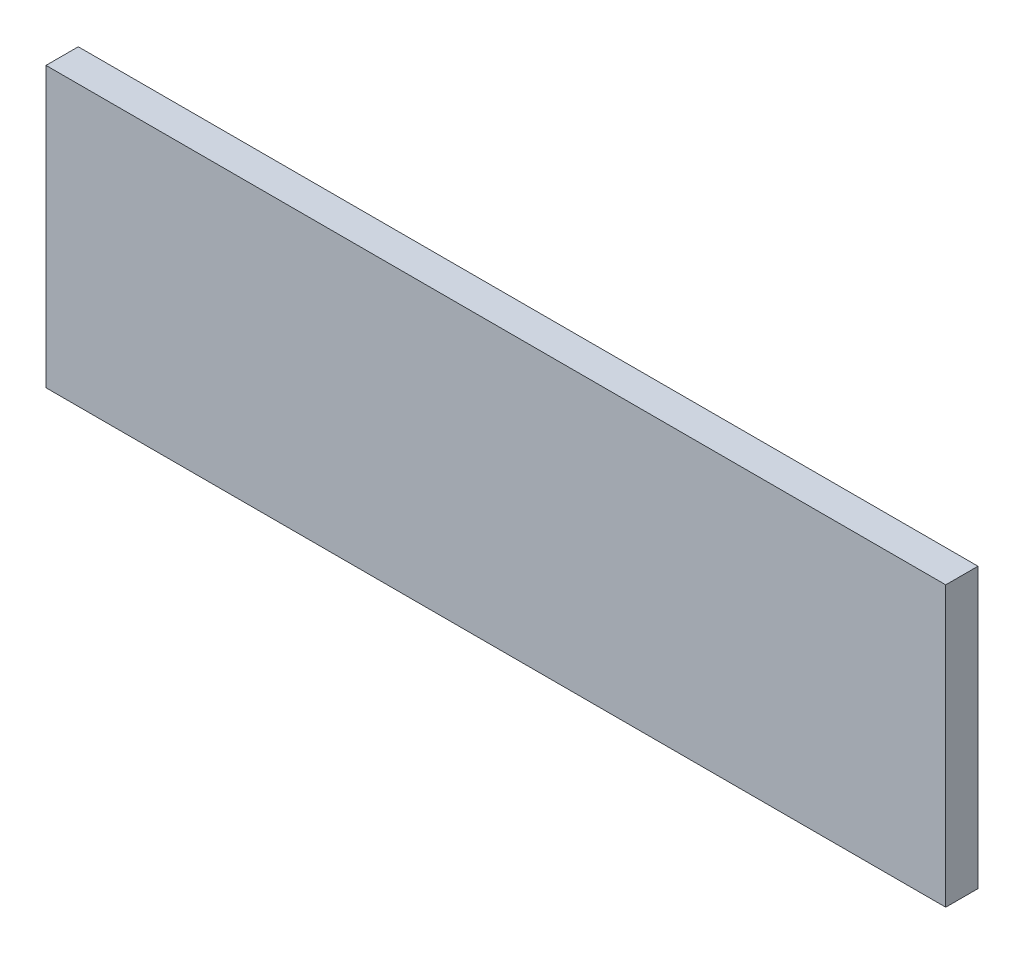
ISO-10303-21;
HEADER;
FILE_DESCRIPTION(('STEP AP214'),'2;1');
FILE_NAME('part.step','',(''),(''),'','','');
FILE_SCHEMA(('AUTOMOTIVE_DESIGN { 1 0 10303 214 1 1 1 1 }'));
ENDSEC;
DATA;
#1=APPLICATION_CONTEXT('core data for automotive mechanical design processes');
#2=APPLICATION_PROTOCOL_DEFINITION('international standard','automotive_design',2000,#1);
#3=PRODUCT_CONTEXT('',#1,'mechanical');
#4=PRODUCT('Part','Part','',(#3));
#5=PRODUCT_RELATED_PRODUCT_CATEGORY('part','',(#4));
#6=PRODUCT_DEFINITION_FORMATION('','',#4);
#7=PRODUCT_DEFINITION_CONTEXT('part definition',#1,'design');
#8=PRODUCT_DEFINITION('design','',#6,#7);
#9=PRODUCT_DEFINITION_SHAPE('','',#8);
#10=(LENGTH_UNIT() NAMED_UNIT(*) SI_UNIT(.MILLI.,.METRE.));
#11=(NAMED_UNIT(*) PLANE_ANGLE_UNIT() SI_UNIT($,.RADIAN.));
#12=(NAMED_UNIT(*) SI_UNIT($,.STERADIAN.) SOLID_ANGLE_UNIT());
#13=UNCERTAINTY_MEASURE_WITH_UNIT(LENGTH_MEASURE(1.E-05),#10,'distance_accuracy_value','');
#14=(GEOMETRIC_REPRESENTATION_CONTEXT(3) GLOBAL_UNCERTAINTY_ASSIGNED_CONTEXT((#13)) GLOBAL_UNIT_ASSIGNED_CONTEXT((#10,
#11,#12)) REPRESENTATION_CONTEXT('',''));
#15=CARTESIAN_POINT('',(0.,0.,0.));
#16=DIRECTION('',(0.,0.,1.));
#17=DIRECTION('',(1.,0.,0.));
#18=AXIS2_PLACEMENT_3D('',#15,#16,#17);
#19=CARTESIAN_POINT('',(-5.38461538461539,6.15384615384615,0.6));
#20=DIRECTION('',(0.,-1.,0.));
#21=DIRECTION('',(0.,0.,-1.));
#22=AXIS2_PLACEMENT_3D('',#19,#20,#21);
#23=PLANE('',#22);
#24=DIRECTION('',(1.,0.,0.));
#25=VECTOR('',#24,1.);
#26=CARTESIAN_POINT('',(-5.38461538461539,6.15384615384615,1.));
#27=LINE('',#26,#25);
#28=CARTESIAN_POINT('',(-5.38461538461539,6.15384615384615,1.));
#29=VERTEX_POINT('',#28);
#30=CARTESIAN_POINT('',(5.76923076923077,6.15384615384615,1.));
#31=VERTEX_POINT('',#30);
#32=EDGE_CURVE('E105',#29,#31,#27,.T.);
#33=ORIENTED_EDGE('',*,*,#32,.T.);
#34=DIRECTION('',(0.,0.,1.));
#35=VECTOR('',#34,1.);
#36=CARTESIAN_POINT('',(5.76923076923077,6.15384615384615,0.6));
#37=LINE('',#36,#35);
#38=CARTESIAN_POINT('',(5.76923076923077,6.15384615384615,0.6));
#39=VERTEX_POINT('',#38);
#40=EDGE_CURVE('E11',#39,#31,#37,.T.);
#41=ORIENTED_EDGE('',*,*,#40,.F.);
#42=DIRECTION('',(1.,0.,0.));
#43=VECTOR('',#42,1.);
#44=CARTESIAN_POINT('',(-5.38461538461539,6.15384615384615,0.6));
#45=LINE('',#44,#43);
#46=CARTESIAN_POINT('',(-5.38461538461539,6.15384615384615,0.6));
#47=VERTEX_POINT('',#46);
#48=EDGE_CURVE('E89',#47,#39,#45,.T.);
#49=ORIENTED_EDGE('',*,*,#48,.F.);
#50=DIRECTION('',(0.,0.,1.));
#51=VECTOR('',#50,1.);
#52=CARTESIAN_POINT('',(-5.38461538461539,6.15384615384615,0.6));
#53=LINE('',#52,#51);
#54=EDGE_CURVE('E97',#47,#29,#53,.T.);
#55=ORIENTED_EDGE('',*,*,#54,.T.);
#56=EDGE_LOOP('',(#33,#41,#49,#55));
#57=FACE_BOUND('',#56,.T.);
#58=ADVANCED_FACE('F39',(#57),#23,.F.);
#59=CARTESIAN_POINT('',(5.76923076923077,6.15384615384615,0.6));
#60=DIRECTION('',(-1.,0.,0.));
#61=DIRECTION('',(0.,0.,1.));
#62=AXIS2_PLACEMENT_3D('',#59,#60,#61);
#63=PLANE('',#62);
#64=DIRECTION('',(0.,-1.,0.));
#65=VECTOR('',#64,1.);
#66=CARTESIAN_POINT('',(5.76923076923077,6.15384615384615,1.));
#67=LINE('',#66,#65);
#68=CARTESIAN_POINT('',(5.76923076923077,2.69230769230769,1.));
#69=VERTEX_POINT('',#68);
#70=EDGE_CURVE('E92',#31,#69,#67,.T.);
#71=ORIENTED_EDGE('',*,*,#70,.T.);
#72=DIRECTION('',(0.,0.,1.));
#73=VECTOR('',#72,1.);
#74=CARTESIAN_POINT('',(5.76923076923077,2.69230769230769,0.6));
#75=LINE('',#74,#73);
#76=CARTESIAN_POINT('',(5.76923076923077,2.69230769230769,0.6));
#77=VERTEX_POINT('',#76);
#78=EDGE_CURVE('E50',#77,#69,#75,.T.);
#79=ORIENTED_EDGE('',*,*,#78,.F.);
#80=DIRECTION('',(0.,-1.,0.));
#81=VECTOR('',#80,1.);
#82=CARTESIAN_POINT('',(5.76923076923077,6.15384615384615,0.6));
#83=LINE('',#82,#81);
#84=EDGE_CURVE('E82',#39,#77,#83,.T.);
#85=ORIENTED_EDGE('',*,*,#84,.F.);
#86=ORIENTED_EDGE('',*,*,#40,.T.);
#87=EDGE_LOOP('',(#71,#79,#85,#86));
#88=FACE_BOUND('',#87,.T.);
#89=ADVANCED_FACE('F93',(#88),#63,.F.);
#90=CARTESIAN_POINT('',(5.76923076923077,2.69230769230769,0.6));
#91=DIRECTION('',(0.,1.,0.));
#92=DIRECTION('',(0.,0.,1.));
#93=AXIS2_PLACEMENT_3D('',#90,#91,#92);
#94=PLANE('',#93);
#95=DIRECTION('',(-1.,0.,0.));
#96=VECTOR('',#95,1.);
#97=CARTESIAN_POINT('',(5.76923076923077,2.69230769230769,1.));
#98=LINE('',#97,#96);
#99=CARTESIAN_POINT('',(-5.38461538461539,2.69230769230769,1.));
#100=VERTEX_POINT('',#99);
#101=EDGE_CURVE('E74',#69,#100,#98,.T.);
#102=ORIENTED_EDGE('',*,*,#101,.T.);
#103=DIRECTION('',(0.,0.,1.));
#104=VECTOR('',#103,1.);
#105=CARTESIAN_POINT('',(-5.38461538461539,2.69230769230769,0.6));
#106=LINE('',#105,#104);
#107=CARTESIAN_POINT('',(-5.38461538461539,2.69230769230769,0.6));
#108=VERTEX_POINT('',#107);
#109=EDGE_CURVE('E94',#108,#100,#106,.T.);
#110=ORIENTED_EDGE('',*,*,#109,.F.);
#111=DIRECTION('',(-1.,0.,0.));
#112=VECTOR('',#111,1.);
#113=CARTESIAN_POINT('',(5.76923076923077,2.69230769230769,0.6));
#114=LINE('',#113,#112);
#115=EDGE_CURVE('E88',#77,#108,#114,.T.);
#116=ORIENTED_EDGE('',*,*,#115,.F.);
#117=ORIENTED_EDGE('',*,*,#78,.T.);
#118=EDGE_LOOP('',(#102,#110,#116,#117));
#119=FACE_BOUND('',#118,.T.);
#120=ADVANCED_FACE('F96',(#119),#94,.F.);
#121=CARTESIAN_POINT('',(-5.38461538461539,2.69230769230769,0.6));
#122=DIRECTION('',(1.,0.,0.));
#123=DIRECTION('',(0.,0.,-1.));
#124=AXIS2_PLACEMENT_3D('',#121,#122,#123);
#125=PLANE('',#124);
#126=DIRECTION('',(0.,1.,0.));
#127=VECTOR('',#126,1.);
#128=CARTESIAN_POINT('',(-5.38461538461539,2.69230769230769,1.));
#129=LINE('',#128,#127);
#130=EDGE_CURVE('E76',#100,#29,#129,.T.);
#131=ORIENTED_EDGE('',*,*,#130,.T.);
#132=ORIENTED_EDGE('',*,*,#54,.F.);
#133=DIRECTION('',(0.,1.,0.));
#134=VECTOR('',#133,1.);
#135=CARTESIAN_POINT('',(-5.38461538461539,2.69230769230769,0.6));
#136=LINE('',#135,#134);
#137=EDGE_CURVE('E54',#108,#47,#136,.T.);
#138=ORIENTED_EDGE('',*,*,#137,.F.);
#139=ORIENTED_EDGE('',*,*,#109,.T.);
#140=EDGE_LOOP('',(#131,#132,#138,#139));
#141=FACE_BOUND('',#140,.T.);
#142=ADVANCED_FACE('F106',(#141),#125,.F.);
#143=CARTESIAN_POINT('',(0.,0.,0.6));
#144=DIRECTION('',(0.,0.,-1.));
#145=DIRECTION('',(-1.,0.,0.));
#146=AXIS2_PLACEMENT_3D('',#143,#144,#145);
#147=PLANE('',#146);
#148=ORIENTED_EDGE('',*,*,#48,.T.);
#149=ORIENTED_EDGE('',*,*,#84,.T.);
#150=ORIENTED_EDGE('',*,*,#115,.T.);
#151=ORIENTED_EDGE('',*,*,#137,.T.);
#152=EDGE_LOOP('',(#148,#149,#150,#151));
#153=FACE_BOUND('',#152,.T.);
#154=ADVANCED_FACE('F86',(#153),#147,.T.);
#155=CARTESIAN_POINT('',(0.,0.,1.));
#156=DIRECTION('',(0.,0.,-1.));
#157=DIRECTION('',(-1.,0.,0.));
#158=AXIS2_PLACEMENT_3D('',#155,#156,#157);
#159=PLANE('',#158);
#160=ORIENTED_EDGE('',*,*,#32,.F.);
#161=ORIENTED_EDGE('',*,*,#130,.F.);
#162=ORIENTED_EDGE('',*,*,#101,.F.);
#163=ORIENTED_EDGE('',*,*,#70,.F.);
#164=EDGE_LOOP('',(#160,#161,#162,#163));
#165=FACE_BOUND('',#164,.T.);
#166=ADVANCED_FACE('F115',(#165),#159,.F.);
#167=CLOSED_SHELL('',(#58,#89,#120,#142,#154,#166));
#168=MANIFOLD_SOLID_BREP('B2',#167);
#169=ADVANCED_BREP_SHAPE_REPRESENTATION('',(#18,#168),#14);
#170=SHAPE_DEFINITION_REPRESENTATION(#9,#169);
ENDSEC;
END-ISO-10303-21;
